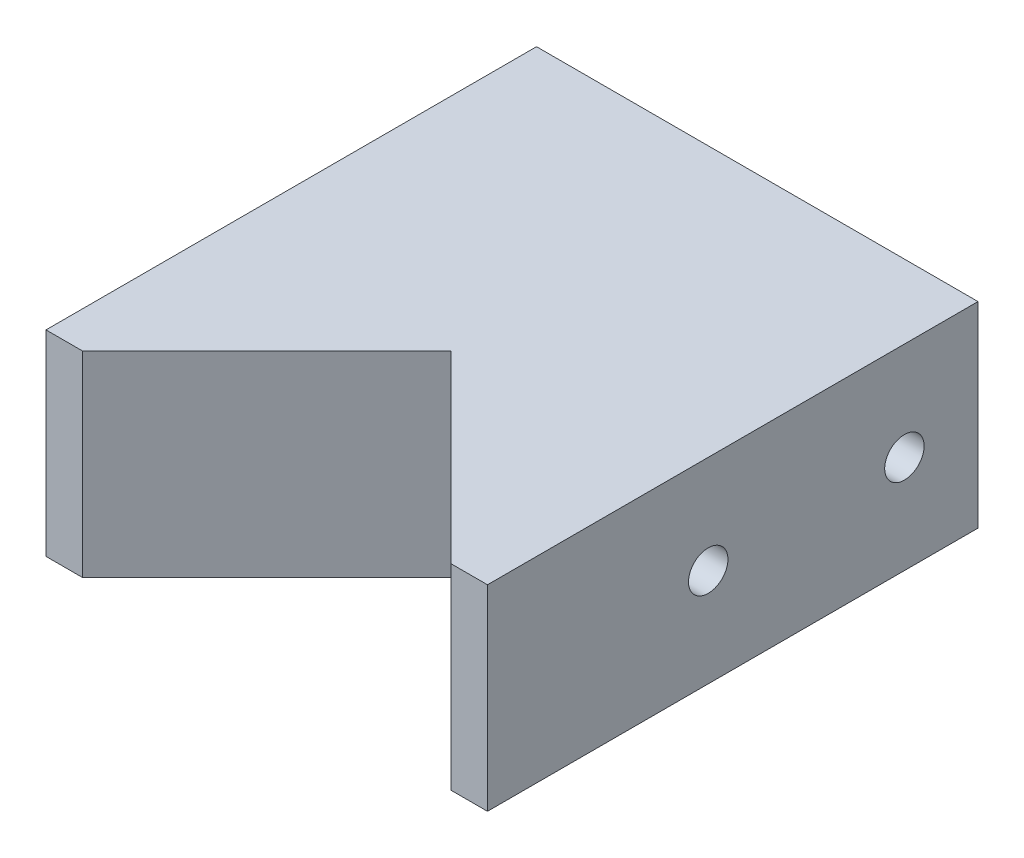
ISO-10303-21;
HEADER;
FILE_DESCRIPTION(('STEP AP214'),'2;1');
FILE_NAME('part.step','',(''),(''),'','','');
FILE_SCHEMA(('AUTOMOTIVE_DESIGN { 1 0 10303 214 1 1 1 1 }'));
ENDSEC;
DATA;
#1=APPLICATION_CONTEXT('core data for automotive mechanical design processes');
#2=APPLICATION_PROTOCOL_DEFINITION('international standard','automotive_design',2000,#1);
#3=PRODUCT_CONTEXT('',#1,'mechanical');
#4=PRODUCT('Part','Part','',(#3));
#5=PRODUCT_RELATED_PRODUCT_CATEGORY('part','',(#4));
#6=PRODUCT_DEFINITION_FORMATION('','',#4);
#7=PRODUCT_DEFINITION_CONTEXT('part definition',#1,'design');
#8=PRODUCT_DEFINITION('design','',#6,#7);
#9=PRODUCT_DEFINITION_SHAPE('','',#8);
#10=(LENGTH_UNIT() NAMED_UNIT(*) SI_UNIT(.MILLI.,.METRE.));
#11=(NAMED_UNIT(*) PLANE_ANGLE_UNIT() SI_UNIT($,.RADIAN.));
#12=(NAMED_UNIT(*) SI_UNIT($,.STERADIAN.) SOLID_ANGLE_UNIT());
#13=UNCERTAINTY_MEASURE_WITH_UNIT(LENGTH_MEASURE(1.E-05),#10,'distance_accuracy_value','');
#14=(GEOMETRIC_REPRESENTATION_CONTEXT(3) GLOBAL_UNCERTAINTY_ASSIGNED_CONTEXT((#13)) GLOBAL_UNIT_ASSIGNED_CONTEXT((#10,
#11,#12)) REPRESENTATION_CONTEXT('',''));
#15=CARTESIAN_POINT('',(0.,0.,0.));
#16=DIRECTION('',(0.,0.,1.));
#17=DIRECTION('',(1.,0.,0.));
#18=AXIS2_PLACEMENT_3D('',#15,#16,#17);
#19=CARTESIAN_POINT('',(0.,0.,63.5));
#20=DIRECTION('',(0.,0.,-1.));
#21=DIRECTION('',(-1.,0.,0.));
#22=AXIS2_PLACEMENT_3D('',#19,#20,#21);
#23=PLANE('',#22);
#24=DIRECTION('',(1.,0.,0.));
#25=VECTOR('',#24,1.);
#26=CARTESIAN_POINT('',(-28.575,-12.7,63.5));
#27=LINE('',#26,#25);
#28=CARTESIAN_POINT('',(-28.575,-12.7,63.5));
#29=VERTEX_POINT('',#28);
#30=CARTESIAN_POINT('',(-23.8252,-12.7,63.5));
#31=VERTEX_POINT('',#30);
#32=EDGE_CURVE('E146',#29,#31,#27,.T.);
#33=ORIENTED_EDGE('',*,*,#32,.T.);
#34=DIRECTION('',(0.,1.,0.));
#35=VECTOR('',#34,1.);
#36=CARTESIAN_POINT('',(-23.8252,-12.7,63.5));
#37=LINE('',#36,#35);
#38=CARTESIAN_POINT('',(-23.8252,12.7,63.5));
#39=VERTEX_POINT('',#38);
#40=EDGE_CURVE('E109',#31,#39,#37,.T.);
#41=ORIENTED_EDGE('',*,*,#40,.T.);
#42=DIRECTION('',(-1.,0.,0.));
#43=VECTOR('',#42,1.);
#44=CARTESIAN_POINT('',(-28.575,12.7,63.5));
#45=LINE('',#44,#43);
#46=CARTESIAN_POINT('',(-28.575,12.7,63.5));
#47=VERTEX_POINT('',#46);
#48=EDGE_CURVE('E142',#39,#47,#45,.T.);
#49=ORIENTED_EDGE('',*,*,#48,.T.);
#50=DIRECTION('',(0.,-1.,0.));
#51=VECTOR('',#50,1.);
#52=CARTESIAN_POINT('',(-28.575,-12.7,63.5));
#53=LINE('',#52,#51);
#54=EDGE_CURVE('E144',#47,#29,#53,.T.);
#55=ORIENTED_EDGE('',*,*,#54,.T.);
#56=EDGE_LOOP('',(#33,#41,#49,#55));
#57=FACE_BOUND('',#56,.T.);
#58=ADVANCED_FACE('F36',(#57),#23,.F.);
#59=CARTESIAN_POINT('',(28.575,-12.7,63.5));
#60=DIRECTION('',(-1.,0.,0.));
#61=DIRECTION('',(0.,0.,1.));
#62=AXIS2_PLACEMENT_3D('',#59,#60,#61);
#63=PLANE('',#62);
#64=CARTESIAN_POINT('',(28.575,0.,34.925));
#65=DIRECTION('',(1.,0.,0.));
#66=DIRECTION('',(0.,0.,-1.));
#67=AXIS2_PLACEMENT_3D('',#64,#65,#66);
#68=CIRCLE('',#67,2.55269999999999);
#69=CARTESIAN_POINT('',(28.575,0.,32.3723));
#70=VERTEX_POINT('',#69);
#71=EDGE_CURVE('E125',#70,#70,#68,.T.);
#72=ORIENTED_EDGE('',*,*,#71,.F.);
#73=EDGE_LOOP('',(#72));
#74=FACE_BOUND('',#73,.T.);
#75=CARTESIAN_POINT('',(28.575,0.,9.525));
#76=DIRECTION('',(1.,0.,0.));
#77=DIRECTION('',(0.,0.,-1.));
#78=AXIS2_PLACEMENT_3D('',#75,#76,#77);
#79=CIRCLE('',#78,2.55269999999999);
#80=CARTESIAN_POINT('',(28.575,0.,6.97230000000001));
#81=VERTEX_POINT('',#80);
#82=EDGE_CURVE('E133',#81,#81,#79,.T.);
#83=ORIENTED_EDGE('',*,*,#82,.F.);
#84=EDGE_LOOP('',(#83));
#85=FACE_BOUND('',#84,.T.);
#86=DIRECTION('',(0.,1.,0.));
#87=VECTOR('',#86,1.);
#88=CARTESIAN_POINT('',(28.575,-12.7,0.));
#89=LINE('',#88,#87);
#90=CARTESIAN_POINT('',(28.575,-12.7,0.));
#91=VERTEX_POINT('',#90);
#92=CARTESIAN_POINT('',(28.575,12.7,0.));
#93=VERTEX_POINT('',#92);
#94=EDGE_CURVE('E139',#91,#93,#89,.T.);
#95=ORIENTED_EDGE('',*,*,#94,.T.);
#96=DIRECTION('',(0.,0.,-1.));
#97=VECTOR('',#96,1.);
#98=CARTESIAN_POINT('',(28.575,12.7,63.5));
#99=LINE('',#98,#97);
#100=CARTESIAN_POINT('',(28.575,12.7,63.5));
#101=VERTEX_POINT('',#100);
#102=EDGE_CURVE('E11',#101,#93,#99,.T.);
#103=ORIENTED_EDGE('',*,*,#102,.F.);
#104=DIRECTION('',(0.,1.,0.));
#105=VECTOR('',#104,1.);
#106=CARTESIAN_POINT('',(28.575,-12.7,63.5));
#107=LINE('',#106,#105);
#108=CARTESIAN_POINT('',(28.575,-12.7,63.5));
#109=VERTEX_POINT('',#108);
#110=EDGE_CURVE('E140',#109,#101,#107,.T.);
#111=ORIENTED_EDGE('',*,*,#110,.F.);
#112=DIRECTION('',(0.,0.,-1.));
#113=VECTOR('',#112,1.);
#114=CARTESIAN_POINT('',(28.575,-12.7,63.5));
#115=LINE('',#114,#113);
#116=EDGE_CURVE('E148',#109,#91,#115,.T.);
#117=ORIENTED_EDGE('',*,*,#116,.T.);
#118=EDGE_LOOP('',(#95,#103,#111,#117));
#119=FACE_BOUND('',#118,.T.);
#120=ADVANCED_FACE('F38',(#74,#85,#119),#63,.F.);
#121=CARTESIAN_POINT('',(-28.575,12.7,63.5));
#122=DIRECTION('',(0.,-1.,0.));
#123=DIRECTION('',(0.,0.,-1.));
#124=AXIS2_PLACEMENT_3D('',#121,#122,#123);
#125=PLANE('',#124);
#126=ORIENTED_EDGE('',*,*,#48,.F.);
#127=DIRECTION('',(-0.707106781186548,0.,0.707106781186547));
#128=VECTOR('',#127,1.);
#129=CARTESIAN_POINT('',(-23.8252,12.7,63.5));
#130=LINE('',#129,#128);
#131=CARTESIAN_POINT('',(0.,12.7,39.6748));
#132=VERTEX_POINT('',#131);
#133=EDGE_CURVE('E120',#132,#39,#130,.T.);
#134=ORIENTED_EDGE('',*,*,#133,.F.);
#135=DIRECTION('',(-0.707106781186547,0.,-0.707106781186548));
#136=VECTOR('',#135,1.);
#137=CARTESIAN_POINT('',(0.,12.7,39.6748));
#138=LINE('',#137,#136);
#139=CARTESIAN_POINT('',(23.8252,12.7,63.5));
#140=VERTEX_POINT('',#139);
#141=EDGE_CURVE('E106',#140,#132,#138,.T.);
#142=ORIENTED_EDGE('',*,*,#141,.F.);
#143=EDGE_CURVE('E88',#101,#140,#45,.T.);
#144=ORIENTED_EDGE('',*,*,#143,.F.);
#145=ORIENTED_EDGE('',*,*,#102,.T.);
#146=DIRECTION('',(-1.,0.,0.));
#147=VECTOR('',#146,1.);
#148=CARTESIAN_POINT('',(-28.575,12.7,0.));
#149=LINE('',#148,#147);
#150=CARTESIAN_POINT('',(-28.575,12.7,0.));
#151=VERTEX_POINT('',#150);
#152=EDGE_CURVE('E151',#93,#151,#149,.T.);
#153=ORIENTED_EDGE('',*,*,#152,.T.);
#154=DIRECTION('',(0.,0.,-1.));
#155=VECTOR('',#154,1.);
#156=CARTESIAN_POINT('',(-28.575,12.7,63.5));
#157=LINE('',#156,#155);
#158=EDGE_CURVE('E44',#47,#151,#157,.T.);
#159=ORIENTED_EDGE('',*,*,#158,.F.);
#160=EDGE_LOOP('',(#126,#134,#142,#144,#145,#153,#159));
#161=FACE_BOUND('',#160,.T.);
#162=ADVANCED_FACE('F173',(#161),#125,.F.);
#163=CARTESIAN_POINT('',(-28.575,-12.7,63.5));
#164=DIRECTION('',(1.,0.,0.));
#165=DIRECTION('',(0.,0.,-1.));
#166=AXIS2_PLACEMENT_3D('',#163,#164,#165);
#167=PLANE('',#166);
#168=CARTESIAN_POINT('',(-28.575,0.,34.925));
#169=DIRECTION('',(1.,0.,0.));
#170=DIRECTION('',(0.,0.,-1.));
#171=AXIS2_PLACEMENT_3D('',#168,#169,#170);
#172=CIRCLE('',#171,2.55269999999999);
#173=CARTESIAN_POINT('',(-28.575,0.,32.3723));
#174=VERTEX_POINT('',#173);
#175=EDGE_CURVE('E130',#174,#174,#172,.T.);
#176=ORIENTED_EDGE('',*,*,#175,.T.);
#177=EDGE_LOOP('',(#176));
#178=FACE_BOUND('',#177,.T.);
#179=CARTESIAN_POINT('',(-28.575,0.,9.525));
#180=DIRECTION('',(1.,0.,0.));
#181=DIRECTION('',(0.,0.,-1.));
#182=AXIS2_PLACEMENT_3D('',#179,#180,#181);
#183=CIRCLE('',#182,2.55269999999999);
#184=CARTESIAN_POINT('',(-28.575,0.,6.97230000000001));
#185=VERTEX_POINT('',#184);
#186=EDGE_CURVE('E136',#185,#185,#183,.T.);
#187=ORIENTED_EDGE('',*,*,#186,.T.);
#188=EDGE_LOOP('',(#187));
#189=FACE_BOUND('',#188,.T.);
#190=DIRECTION('',(0.,-1.,0.));
#191=VECTOR('',#190,1.);
#192=CARTESIAN_POINT('',(-28.575,-12.7,0.));
#193=LINE('',#192,#191);
#194=CARTESIAN_POINT('',(-28.575,-12.7,0.));
#195=VERTEX_POINT('',#194);
#196=EDGE_CURVE('E153',#151,#195,#193,.T.);
#197=ORIENTED_EDGE('',*,*,#196,.T.);
#198=DIRECTION('',(0.,0.,-1.));
#199=VECTOR('',#198,1.);
#200=CARTESIAN_POINT('',(-28.575,-12.7,63.5));
#201=LINE('',#200,#199);
#202=EDGE_CURVE('E157',#29,#195,#201,.T.);
#203=ORIENTED_EDGE('',*,*,#202,.F.);
#204=ORIENTED_EDGE('',*,*,#54,.F.);
#205=ORIENTED_EDGE('',*,*,#158,.T.);
#206=EDGE_LOOP('',(#197,#203,#204,#205));
#207=FACE_BOUND('',#206,.T.);
#208=ADVANCED_FACE('F163',(#178,#189,#207),#167,.F.);
#209=CARTESIAN_POINT('',(-28.575,-12.7,63.5));
#210=DIRECTION('',(0.,1.,0.));
#211=DIRECTION('',(0.,0.,1.));
#212=AXIS2_PLACEMENT_3D('',#209,#210,#211);
#213=PLANE('',#212);
#214=DIRECTION('',(-0.707106781186547,0.,-0.707106781186548));
#215=VECTOR('',#214,1.);
#216=CARTESIAN_POINT('',(0.,-12.7,39.6748));
#217=LINE('',#216,#215);
#218=CARTESIAN_POINT('',(23.8252,-12.7,63.5));
#219=VERTEX_POINT('',#218);
#220=CARTESIAN_POINT('',(0.,-12.7,39.6748));
#221=VERTEX_POINT('',#220);
#222=EDGE_CURVE('E51',#219,#221,#217,.T.);
#223=ORIENTED_EDGE('',*,*,#222,.T.);
#224=DIRECTION('',(-0.707106781186548,0.,0.707106781186547));
#225=VECTOR('',#224,1.);
#226=CARTESIAN_POINT('',(-23.8252,-12.7,63.5));
#227=LINE('',#226,#225);
#228=EDGE_CURVE('E113',#221,#31,#227,.T.);
#229=ORIENTED_EDGE('',*,*,#228,.T.);
#230=ORIENTED_EDGE('',*,*,#32,.F.);
#231=ORIENTED_EDGE('',*,*,#202,.T.);
#232=DIRECTION('',(1.,0.,0.));
#233=VECTOR('',#232,1.);
#234=CARTESIAN_POINT('',(-28.575,-12.7,0.));
#235=LINE('',#234,#233);
#236=EDGE_CURVE('E81',#195,#91,#235,.T.);
#237=ORIENTED_EDGE('',*,*,#236,.T.);
#238=ORIENTED_EDGE('',*,*,#116,.F.);
#239=EDGE_CURVE('E59',#219,#109,#27,.T.);
#240=ORIENTED_EDGE('',*,*,#239,.F.);
#241=EDGE_LOOP('',(#223,#229,#230,#231,#237,#238,#240));
#242=FACE_BOUND('',#241,.T.);
#243=ADVANCED_FACE('F119',(#242),#213,.F.);
#244=ORIENTED_EDGE('',*,*,#143,.T.);
#245=DIRECTION('',(0.,1.,0.));
#246=VECTOR('',#245,1.);
#247=CARTESIAN_POINT('',(23.8252,-12.7,63.5));
#248=LINE('',#247,#246);
#249=EDGE_CURVE('E110',#219,#140,#248,.T.);
#250=ORIENTED_EDGE('',*,*,#249,.F.);
#251=ORIENTED_EDGE('',*,*,#239,.T.);
#252=ORIENTED_EDGE('',*,*,#110,.T.);
#253=EDGE_LOOP('',(#244,#250,#251,#252));
#254=FACE_BOUND('',#253,.T.);
#255=ADVANCED_FACE('F172',(#254),#23,.F.);
#256=CARTESIAN_POINT('',(0.,0.,0.));
#257=DIRECTION('',(0.,0.,-1.));
#258=DIRECTION('',(-1.,0.,0.));
#259=AXIS2_PLACEMENT_3D('',#256,#257,#258);
#260=PLANE('',#259);
#261=ORIENTED_EDGE('',*,*,#94,.F.);
#262=ORIENTED_EDGE('',*,*,#236,.F.);
#263=ORIENTED_EDGE('',*,*,#196,.F.);
#264=ORIENTED_EDGE('',*,*,#152,.F.);
#265=EDGE_LOOP('',(#261,#262,#263,#264));
#266=FACE_BOUND('',#265,.T.);
#267=ADVANCED_FACE('F168',(#266),#260,.T.);
#268=CARTESIAN_POINT('',(28.575,0.,9.525));
#269=DIRECTION('',(1.,0.,0.));
#270=DIRECTION('',(0.,0.,-1.));
#271=AXIS2_PLACEMENT_3D('',#268,#269,#270);
#272=CYLINDRICAL_SURFACE('',#271,2.55269999999999);
#273=ORIENTED_EDGE('',*,*,#186,.F.);
#274=EDGE_LOOP('',(#273));
#275=FACE_BOUND('',#274,.T.);
#276=ORIENTED_EDGE('',*,*,#82,.T.);
#277=EDGE_LOOP('',(#276));
#278=FACE_BOUND('',#277,.T.);
#279=ADVANCED_FACE('F188',(#275,#278),#272,.F.);
#280=CARTESIAN_POINT('',(28.575,0.,34.925));
#281=DIRECTION('',(1.,0.,0.));
#282=DIRECTION('',(0.,0.,-1.));
#283=AXIS2_PLACEMENT_3D('',#280,#281,#282);
#284=CYLINDRICAL_SURFACE('',#283,2.55269999999999);
#285=ORIENTED_EDGE('',*,*,#175,.F.);
#286=EDGE_LOOP('',(#285));
#287=FACE_BOUND('',#286,.T.);
#288=ORIENTED_EDGE('',*,*,#71,.T.);
#289=EDGE_LOOP('',(#288));
#290=FACE_BOUND('',#289,.T.);
#291=ADVANCED_FACE('F218',(#287,#290),#284,.F.);
#292=CARTESIAN_POINT('',(-23.8252,-12.7,63.5));
#293=DIRECTION('',(-0.707106781186547,0.,-0.707106781186548));
#294=DIRECTION('',(-0.707106781186548,0.,0.707106781186547));
#295=AXIS2_PLACEMENT_3D('',#292,#293,#294);
#296=PLANE('',#295);
#297=ORIENTED_EDGE('',*,*,#133,.T.);
#298=ORIENTED_EDGE('',*,*,#40,.F.);
#299=ORIENTED_EDGE('',*,*,#228,.F.);
#300=DIRECTION('',(0.,1.,0.));
#301=VECTOR('',#300,1.);
#302=CARTESIAN_POINT('',(0.,-12.7,39.6748));
#303=LINE('',#302,#301);
#304=EDGE_CURVE('E103',#221,#132,#303,.T.);
#305=ORIENTED_EDGE('',*,*,#304,.T.);
#306=EDGE_LOOP('',(#297,#298,#299,#305));
#307=FACE_BOUND('',#306,.T.);
#308=ADVANCED_FACE('F114',(#307),#296,.F.);
#309=CARTESIAN_POINT('',(0.,-12.7,39.6748));
#310=DIRECTION('',(0.707106781186548,0.,-0.707106781186547));
#311=DIRECTION('',(-0.707106781186547,0.,-0.707106781186548));
#312=AXIS2_PLACEMENT_3D('',#309,#310,#311);
#313=PLANE('',#312);
#314=ORIENTED_EDGE('',*,*,#141,.T.);
#315=ORIENTED_EDGE('',*,*,#304,.F.);
#316=ORIENTED_EDGE('',*,*,#222,.F.);
#317=ORIENTED_EDGE('',*,*,#249,.T.);
#318=EDGE_LOOP('',(#314,#315,#316,#317));
#319=FACE_BOUND('',#318,.T.);
#320=ADVANCED_FACE('F105',(#319),#313,.F.);
#321=CLOSED_SHELL('',(#58,#120,#162,#208,#243,#255,#267,#279,#291,#308,#320));
#322=MANIFOLD_SOLID_BREP('B2',#321);
#323=ADVANCED_BREP_SHAPE_REPRESENTATION('',(#18,#322),#14);
#324=SHAPE_DEFINITION_REPRESENTATION(#9,#323);
ENDSEC;
END-ISO-10303-21;
